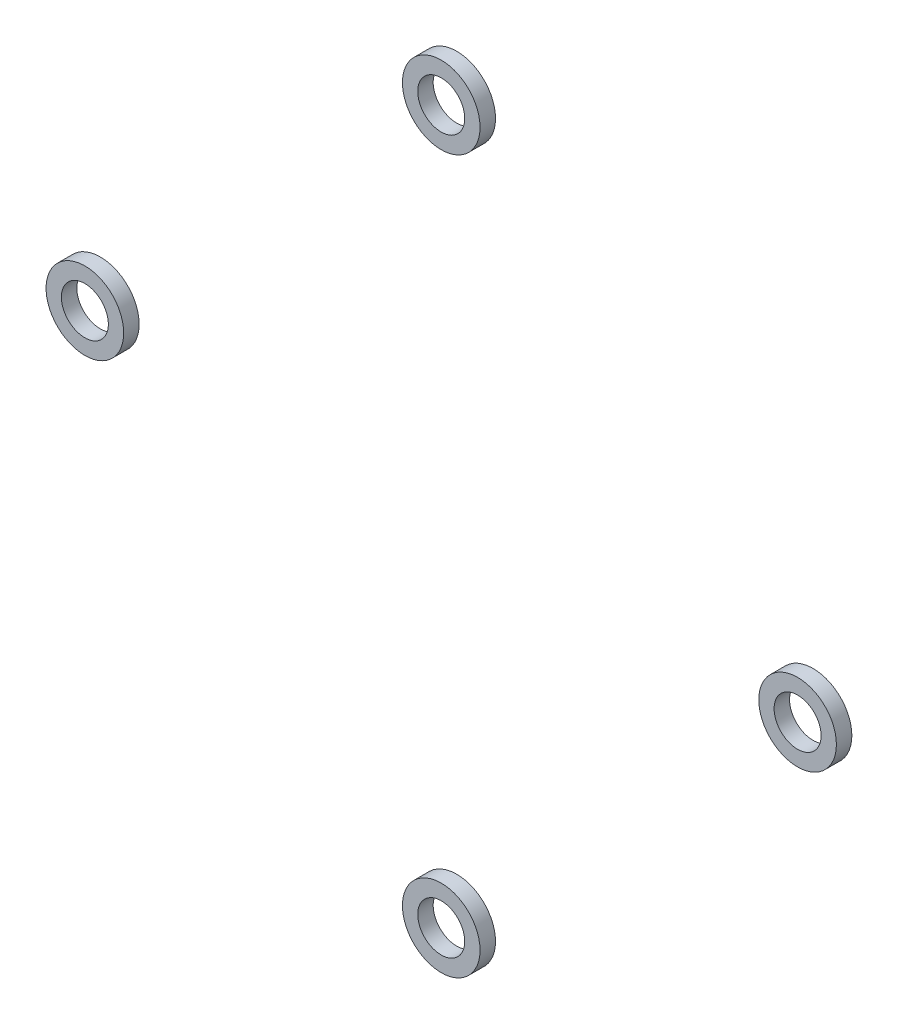
ISO-10303-21;
HEADER;
FILE_DESCRIPTION(('STEP AP214'),'2;1');
FILE_NAME('part.step','',(''),(''),'','','');
FILE_SCHEMA(('AUTOMOTIVE_DESIGN { 1 0 10303 214 1 1 1 1 }'));
ENDSEC;
DATA;
#1=APPLICATION_CONTEXT('core data for automotive mechanical design processes');
#2=APPLICATION_PROTOCOL_DEFINITION('international standard','automotive_design',2000,#1);
#3=PRODUCT_CONTEXT('',#1,'mechanical');
#4=PRODUCT('Part','Part','',(#3));
#5=PRODUCT_RELATED_PRODUCT_CATEGORY('part','',(#4));
#6=PRODUCT_DEFINITION_FORMATION('','',#4);
#7=PRODUCT_DEFINITION_CONTEXT('part definition',#1,'design');
#8=PRODUCT_DEFINITION('design','',#6,#7);
#9=PRODUCT_DEFINITION_SHAPE('','',#8);
#10=(LENGTH_UNIT() NAMED_UNIT(*) SI_UNIT(.MILLI.,.METRE.));
#11=(NAMED_UNIT(*) PLANE_ANGLE_UNIT() SI_UNIT($,.RADIAN.));
#12=(NAMED_UNIT(*) SI_UNIT($,.STERADIAN.) SOLID_ANGLE_UNIT());
#13=UNCERTAINTY_MEASURE_WITH_UNIT(LENGTH_MEASURE(1.E-05),#10,'distance_accuracy_value','');
#14=(GEOMETRIC_REPRESENTATION_CONTEXT(3) GLOBAL_UNCERTAINTY_ASSIGNED_CONTEXT((#13)) GLOBAL_UNIT_ASSIGNED_CONTEXT((#10,
#11,#12)) REPRESENTATION_CONTEXT('',''));
#15=CARTESIAN_POINT('',(0.,0.,0.));
#16=DIRECTION('',(0.,0.,1.));
#17=DIRECTION('',(1.,0.,0.));
#18=AXIS2_PLACEMENT_3D('',#15,#16,#17);
#19=CARTESIAN_POINT('',(-47.7484897317099,-1.51215245581951,54.0000000000118));
#20=DIRECTION('',(0.,0.,1.));
#21=DIRECTION('',(1.,0.,0.));
#22=AXIS2_PLACEMENT_3D('',#19,#20,#21);
#23=PLANE('',#22);
#24=CARTESIAN_POINT('',(-47.7484897317099,-1.51215245581951,54.0000000000118));
#25=DIRECTION('',(0.,0.,1.));
#26=DIRECTION('',(1.,0.,0.));
#27=AXIS2_PLACEMENT_3D('',#24,#25,#26);
#28=CIRCLE('',#27,2.51);
#29=CARTESIAN_POINT('',(-45.2384897317099,-1.51215245581951,54.0000000000118));
#30=VERTEX_POINT('',#29);
#31=EDGE_CURVE('E11',#30,#30,#28,.T.);
#32=ORIENTED_EDGE('',*,*,#31,.T.);
#33=EDGE_LOOP('',(#32));
#34=FACE_BOUND('',#33,.T.);
#35=CARTESIAN_POINT('',(-47.7484897317099,-1.51215245581951,54.0000000000118));
#36=DIRECTION('',(0.,0.,1.));
#37=DIRECTION('',(1.,0.,0.));
#38=AXIS2_PLACEMENT_3D('',#35,#36,#37);
#39=CIRCLE('',#38,1.52);
#40=CARTESIAN_POINT('',(-46.2284897317099,-1.51215245581951,54.0000000000118));
#41=VERTEX_POINT('',#40);
#42=EDGE_CURVE('E53',#41,#41,#39,.T.);
#43=ORIENTED_EDGE('',*,*,#42,.F.);
#44=EDGE_LOOP('',(#43));
#45=FACE_BOUND('',#44,.T.);
#46=ADVANCED_FACE('F42',(#34,#45),#23,.T.);
#47=CARTESIAN_POINT('',(-47.7484897317099,-1.51215245581951,53.0000000000118));
#48=DIRECTION('',(0.,0.,1.));
#49=DIRECTION('',(1.,0.,0.));
#50=AXIS2_PLACEMENT_3D('',#47,#48,#49);
#51=PLANE('',#50);
#52=CARTESIAN_POINT('',(-47.7484897317099,-1.51215245581951,53.0000000000118));
#53=DIRECTION('',(0.,0.,1.));
#54=DIRECTION('',(1.,0.,0.));
#55=AXIS2_PLACEMENT_3D('',#52,#53,#54);
#56=CIRCLE('',#55,2.51);
#57=CARTESIAN_POINT('',(-45.2384897317099,-1.51215245581951,53.0000000000118));
#58=VERTEX_POINT('',#57);
#59=EDGE_CURVE('E46',#58,#58,#56,.T.);
#60=ORIENTED_EDGE('',*,*,#59,.F.);
#61=EDGE_LOOP('',(#60));
#62=FACE_BOUND('',#61,.T.);
#63=CARTESIAN_POINT('',(-47.7484897317099,-1.51215245581951,53.0000000000118));
#64=DIRECTION('',(0.,0.,1.));
#65=DIRECTION('',(1.,0.,0.));
#66=AXIS2_PLACEMENT_3D('',#63,#64,#65);
#67=CIRCLE('',#66,1.52);
#68=CARTESIAN_POINT('',(-46.2284897317099,-1.51215245581951,53.0000000000118));
#69=VERTEX_POINT('',#68);
#70=EDGE_CURVE('E55',#69,#69,#67,.T.);
#71=ORIENTED_EDGE('',*,*,#70,.T.);
#72=EDGE_LOOP('',(#71));
#73=FACE_BOUND('',#72,.T.);
#74=ADVANCED_FACE('F65',(#62,#73),#51,.F.);
#75=CARTESIAN_POINT('',(-47.7484897317099,-1.51215245581951,54.0000000000118));
#76=DIRECTION('',(0.,0.,-1.));
#77=DIRECTION('',(-1.,0.,0.));
#78=AXIS2_PLACEMENT_3D('',#75,#76,#77);
#79=CYLINDRICAL_SURFACE('',#78,2.51);
#80=ORIENTED_EDGE('',*,*,#31,.F.);
#81=EDGE_LOOP('',(#80));
#82=FACE_BOUND('',#81,.T.);
#83=ORIENTED_EDGE('',*,*,#59,.T.);
#84=EDGE_LOOP('',(#83));
#85=FACE_BOUND('',#84,.T.);
#86=ADVANCED_FACE('F44',(#82,#85),#79,.T.);
#87=CARTESIAN_POINT('',(-47.7484897317099,-1.51215245581951,54.0000000000118));
#88=DIRECTION('',(0.,0.,-1.));
#89=DIRECTION('',(-1.,0.,0.));
#90=AXIS2_PLACEMENT_3D('',#87,#88,#89);
#91=CYLINDRICAL_SURFACE('',#90,1.52);
#92=ORIENTED_EDGE('',*,*,#42,.T.);
#93=EDGE_LOOP('',(#92));
#94=FACE_BOUND('',#93,.T.);
#95=ORIENTED_EDGE('',*,*,#70,.F.);
#96=EDGE_LOOP('',(#95));
#97=FACE_BOUND('',#96,.T.);
#98=ADVANCED_FACE('F61',(#94,#97),#91,.F.);
#99=CLOSED_SHELL('',(#46,#74,#86,#98));
#100=MANIFOLD_SOLID_BREP('B2',#99);
#101=CARTESIAN_POINT('',(-24.6984901117098,-24.5621520758178,54.0000000000118));
#102=DIRECTION('',(0.,0.,1.));
#103=DIRECTION('',(1.,0.,0.));
#104=AXIS2_PLACEMENT_3D('',#101,#102,#103);
#105=PLANE('',#104);
#106=CARTESIAN_POINT('',(-24.6984901117098,-24.5621520758178,54.0000000000118));
#107=DIRECTION('',(0.,0.,1.));
#108=DIRECTION('',(1.,0.,0.));
#109=AXIS2_PLACEMENT_3D('',#106,#107,#108);
#110=CIRCLE('',#109,2.51);
#111=CARTESIAN_POINT('',(-22.1884901117098,-24.5621520758178,54.0000000000118));
#112=VERTEX_POINT('',#111);
#113=EDGE_CURVE('E41',#112,#112,#110,.T.);
#114=ORIENTED_EDGE('',*,*,#113,.T.);
#115=EDGE_LOOP('',(#114));
#116=FACE_BOUND('',#115,.T.);
#117=CARTESIAN_POINT('',(-24.6984901117098,-24.5621520758178,54.0000000000118));
#118=DIRECTION('',(0.,0.,1.));
#119=DIRECTION('',(1.,0.,0.));
#120=AXIS2_PLACEMENT_3D('',#117,#118,#119);
#121=CIRCLE('',#120,1.52);
#122=CARTESIAN_POINT('',(-23.1784901117098,-24.5621520758178,54.0000000000118));
#123=VERTEX_POINT('',#122);
#124=EDGE_CURVE('E123',#123,#123,#121,.T.);
#125=ORIENTED_EDGE('',*,*,#124,.F.);
#126=EDGE_LOOP('',(#125));
#127=FACE_BOUND('',#126,.T.);
#128=ADVANCED_FACE('F112',(#116,#127),#105,.T.);
#129=CARTESIAN_POINT('',(-24.6984901117098,-24.5621520758178,53.0000000000118));
#130=DIRECTION('',(0.,0.,1.));
#131=DIRECTION('',(1.,0.,0.));
#132=AXIS2_PLACEMENT_3D('',#129,#130,#131);
#133=PLANE('',#132);
#134=CARTESIAN_POINT('',(-24.6984901117098,-24.5621520758178,53.0000000000118));
#135=DIRECTION('',(0.,0.,1.));
#136=DIRECTION('',(1.,0.,0.));
#137=AXIS2_PLACEMENT_3D('',#134,#135,#136);
#138=CIRCLE('',#137,2.51);
#139=CARTESIAN_POINT('',(-22.1884901117098,-24.5621520758178,53.0000000000118));
#140=VERTEX_POINT('',#139);
#141=EDGE_CURVE('E116',#140,#140,#138,.T.);
#142=ORIENTED_EDGE('',*,*,#141,.F.);
#143=EDGE_LOOP('',(#142));
#144=FACE_BOUND('',#143,.T.);
#145=CARTESIAN_POINT('',(-24.6984901117098,-24.5621520758178,53.0000000000118));
#146=DIRECTION('',(0.,0.,1.));
#147=DIRECTION('',(1.,0.,0.));
#148=AXIS2_PLACEMENT_3D('',#145,#146,#147);
#149=CIRCLE('',#148,1.52);
#150=CARTESIAN_POINT('',(-23.1784901117098,-24.5621520758178,53.0000000000118));
#151=VERTEX_POINT('',#150);
#152=EDGE_CURVE('E125',#151,#151,#149,.T.);
#153=ORIENTED_EDGE('',*,*,#152,.T.);
#154=EDGE_LOOP('',(#153));
#155=FACE_BOUND('',#154,.T.);
#156=ADVANCED_FACE('F135',(#144,#155),#133,.F.);
#157=CARTESIAN_POINT('',(-24.6984901117098,-24.5621520758178,54.0000000000118));
#158=DIRECTION('',(0.,0.,-1.));
#159=DIRECTION('',(-1.,0.,0.));
#160=AXIS2_PLACEMENT_3D('',#157,#158,#159);
#161=CYLINDRICAL_SURFACE('',#160,2.51);
#162=ORIENTED_EDGE('',*,*,#113,.F.);
#163=EDGE_LOOP('',(#162));
#164=FACE_BOUND('',#163,.T.);
#165=ORIENTED_EDGE('',*,*,#141,.T.);
#166=EDGE_LOOP('',(#165));
#167=FACE_BOUND('',#166,.T.);
#168=ADVANCED_FACE('F114',(#164,#167),#161,.T.);
#169=CARTESIAN_POINT('',(-24.6984901117098,-24.5621520758178,54.0000000000118));
#170=DIRECTION('',(0.,0.,-1.));
#171=DIRECTION('',(-1.,0.,0.));
#172=AXIS2_PLACEMENT_3D('',#169,#170,#171);
#173=CYLINDRICAL_SURFACE('',#172,1.52);
#174=ORIENTED_EDGE('',*,*,#124,.T.);
#175=EDGE_LOOP('',(#174));
#176=FACE_BOUND('',#175,.T.);
#177=ORIENTED_EDGE('',*,*,#152,.F.);
#178=EDGE_LOOP('',(#177));
#179=FACE_BOUND('',#178,.T.);
#180=ADVANCED_FACE('F131',(#176,#179),#173,.F.);
#181=CLOSED_SHELL('',(#128,#156,#168,#180));
#182=MANIFOLD_SOLID_BREP('B6',#181);
#183=CARTESIAN_POINT('',(-1.64849049171162,-1.51215245581764,54.0000000000118));
#184=DIRECTION('',(0.,0.,1.));
#185=DIRECTION('',(1.,0.,0.));
#186=AXIS2_PLACEMENT_3D('',#183,#184,#185);
#187=PLANE('',#186);
#188=CARTESIAN_POINT('',(-1.64849049171162,-1.51215245581764,54.0000000000118));
#189=DIRECTION('',(0.,0.,1.));
#190=DIRECTION('',(1.,0.,0.));
#191=AXIS2_PLACEMENT_3D('',#188,#189,#190);
#192=CIRCLE('',#191,2.51);
#193=CARTESIAN_POINT('',(0.861509508288372,-1.51215245581764,54.0000000000118));
#194=VERTEX_POINT('',#193);
#195=EDGE_CURVE('E111',#194,#194,#192,.T.);
#196=ORIENTED_EDGE('',*,*,#195,.T.);
#197=EDGE_LOOP('',(#196));
#198=FACE_BOUND('',#197,.T.);
#199=CARTESIAN_POINT('',(-1.64849049171162,-1.51215245581764,54.0000000000118));
#200=DIRECTION('',(0.,0.,1.));
#201=DIRECTION('',(1.,0.,0.));
#202=AXIS2_PLACEMENT_3D('',#199,#200,#201);
#203=CIRCLE('',#202,1.52);
#204=CARTESIAN_POINT('',(-0.128490491711625,-1.51215245581764,54.0000000000118));
#205=VERTEX_POINT('',#204);
#206=EDGE_CURVE('E192',#205,#205,#203,.T.);
#207=ORIENTED_EDGE('',*,*,#206,.F.);
#208=EDGE_LOOP('',(#207));
#209=FACE_BOUND('',#208,.T.);
#210=ADVANCED_FACE('F181',(#198,#209),#187,.T.);
#211=CARTESIAN_POINT('',(-1.64849049171162,-1.51215245581764,53.0000000000118));
#212=DIRECTION('',(0.,0.,1.));
#213=DIRECTION('',(1.,0.,0.));
#214=AXIS2_PLACEMENT_3D('',#211,#212,#213);
#215=PLANE('',#214);
#216=CARTESIAN_POINT('',(-1.64849049171162,-1.51215245581764,53.0000000000118));
#217=DIRECTION('',(0.,0.,1.));
#218=DIRECTION('',(1.,0.,0.));
#219=AXIS2_PLACEMENT_3D('',#216,#217,#218);
#220=CIRCLE('',#219,2.51);
#221=CARTESIAN_POINT('',(0.861509508288372,-1.51215245581764,53.0000000000118));
#222=VERTEX_POINT('',#221);
#223=EDGE_CURVE('E185',#222,#222,#220,.T.);
#224=ORIENTED_EDGE('',*,*,#223,.F.);
#225=EDGE_LOOP('',(#224));
#226=FACE_BOUND('',#225,.T.);
#227=CARTESIAN_POINT('',(-1.64849049171162,-1.51215245581764,53.0000000000118));
#228=DIRECTION('',(0.,0.,1.));
#229=DIRECTION('',(1.,0.,0.));
#230=AXIS2_PLACEMENT_3D('',#227,#228,#229);
#231=CIRCLE('',#230,1.52);
#232=CARTESIAN_POINT('',(-0.128490491711625,-1.51215245581764,53.0000000000118));
#233=VERTEX_POINT('',#232);
#234=EDGE_CURVE('E194',#233,#233,#231,.T.);
#235=ORIENTED_EDGE('',*,*,#234,.T.);
#236=EDGE_LOOP('',(#235));
#237=FACE_BOUND('',#236,.T.);
#238=ADVANCED_FACE('F204',(#226,#237),#215,.F.);
#239=CARTESIAN_POINT('',(-1.64849049171162,-1.51215245581764,54.0000000000118));
#240=DIRECTION('',(0.,0.,-1.));
#241=DIRECTION('',(-1.,0.,0.));
#242=AXIS2_PLACEMENT_3D('',#239,#240,#241);
#243=CYLINDRICAL_SURFACE('',#242,2.51);
#244=ORIENTED_EDGE('',*,*,#195,.F.);
#245=EDGE_LOOP('',(#244));
#246=FACE_BOUND('',#245,.T.);
#247=ORIENTED_EDGE('',*,*,#223,.T.);
#248=EDGE_LOOP('',(#247));
#249=FACE_BOUND('',#248,.T.);
#250=ADVANCED_FACE('F183',(#246,#249),#243,.T.);
#251=CARTESIAN_POINT('',(-1.64849049171162,-1.51215245581764,54.0000000000118));
#252=DIRECTION('',(0.,0.,-1.));
#253=DIRECTION('',(-1.,0.,0.));
#254=AXIS2_PLACEMENT_3D('',#251,#252,#253);
#255=CYLINDRICAL_SURFACE('',#254,1.52);
#256=ORIENTED_EDGE('',*,*,#206,.T.);
#257=EDGE_LOOP('',(#256));
#258=FACE_BOUND('',#257,.T.);
#259=ORIENTED_EDGE('',*,*,#234,.F.);
#260=EDGE_LOOP('',(#259));
#261=FACE_BOUND('',#260,.T.);
#262=ADVANCED_FACE('F200',(#258,#261),#255,.F.);
#263=CLOSED_SHELL('',(#210,#238,#250,#262));
#264=MANIFOLD_SOLID_BREP('B36',#263);
#265=CARTESIAN_POINT('',(-24.6984901117119,21.5378471641805,54.0000000000118));
#266=DIRECTION('',(0.,0.,1.));
#267=DIRECTION('',(1.,0.,0.));
#268=AXIS2_PLACEMENT_3D('',#265,#266,#267);
#269=PLANE('',#268);
#270=CARTESIAN_POINT('',(-24.6984901117119,21.5378471641805,54.0000000000118));
#271=DIRECTION('',(0.,0.,1.));
#272=DIRECTION('',(1.,0.,0.));
#273=AXIS2_PLACEMENT_3D('',#270,#271,#272);
#274=CIRCLE('',#273,2.51);
#275=CARTESIAN_POINT('',(-22.1884901117119,21.5378471641805,54.0000000000118));
#276=VERTEX_POINT('',#275);
#277=EDGE_CURVE('E180',#276,#276,#274,.T.);
#278=ORIENTED_EDGE('',*,*,#277,.T.);
#279=EDGE_LOOP('',(#278));
#280=FACE_BOUND('',#279,.T.);
#281=CARTESIAN_POINT('',(-24.6984901117119,21.5378471641805,54.0000000000118));
#282=DIRECTION('',(0.,0.,1.));
#283=DIRECTION('',(1.,0.,0.));
#284=AXIS2_PLACEMENT_3D('',#281,#282,#283);
#285=CIRCLE('',#284,1.52);
#286=CARTESIAN_POINT('',(-23.1784901117119,21.5378471641805,54.0000000000118));
#287=VERTEX_POINT('',#286);
#288=EDGE_CURVE('E254',#287,#287,#285,.T.);
#289=ORIENTED_EDGE('',*,*,#288,.F.);
#290=EDGE_LOOP('',(#289));
#291=FACE_BOUND('',#290,.T.);
#292=ADVANCED_FACE('F243',(#280,#291),#269,.T.);
#293=CARTESIAN_POINT('',(-24.6984901117119,21.5378471641805,53.0000000000118));
#294=DIRECTION('',(0.,0.,1.));
#295=DIRECTION('',(1.,0.,0.));
#296=AXIS2_PLACEMENT_3D('',#293,#294,#295);
#297=PLANE('',#296);
#298=CARTESIAN_POINT('',(-24.6984901117119,21.5378471641805,53.0000000000118));
#299=DIRECTION('',(0.,0.,1.));
#300=DIRECTION('',(1.,0.,0.));
#301=AXIS2_PLACEMENT_3D('',#298,#299,#300);
#302=CIRCLE('',#301,2.51);
#303=CARTESIAN_POINT('',(-22.1884901117119,21.5378471641805,53.0000000000118));
#304=VERTEX_POINT('',#303);
#305=EDGE_CURVE('E247',#304,#304,#302,.T.);
#306=ORIENTED_EDGE('',*,*,#305,.F.);
#307=EDGE_LOOP('',(#306));
#308=FACE_BOUND('',#307,.T.);
#309=CARTESIAN_POINT('',(-24.6984901117119,21.5378471641805,53.0000000000118));
#310=DIRECTION('',(0.,0.,1.));
#311=DIRECTION('',(1.,0.,0.));
#312=AXIS2_PLACEMENT_3D('',#309,#310,#311);
#313=CIRCLE('',#312,1.52);
#314=CARTESIAN_POINT('',(-23.1784901117119,21.5378471641805,53.0000000000118));
#315=VERTEX_POINT('',#314);
#316=EDGE_CURVE('E256',#315,#315,#313,.T.);
#317=ORIENTED_EDGE('',*,*,#316,.T.);
#318=EDGE_LOOP('',(#317));
#319=FACE_BOUND('',#318,.T.);
#320=ADVANCED_FACE('F266',(#308,#319),#297,.F.);
#321=CARTESIAN_POINT('',(-24.6984901117119,21.5378471641805,54.0000000000118));
#322=DIRECTION('',(0.,0.,-1.));
#323=DIRECTION('',(-1.,0.,0.));
#324=AXIS2_PLACEMENT_3D('',#321,#322,#323);
#325=CYLINDRICAL_SURFACE('',#324,2.51);
#326=ORIENTED_EDGE('',*,*,#277,.F.);
#327=EDGE_LOOP('',(#326));
#328=FACE_BOUND('',#327,.T.);
#329=ORIENTED_EDGE('',*,*,#305,.T.);
#330=EDGE_LOOP('',(#329));
#331=FACE_BOUND('',#330,.T.);
#332=ADVANCED_FACE('F245',(#328,#331),#325,.T.);
#333=CARTESIAN_POINT('',(-24.6984901117119,21.5378471641805,54.0000000000118));
#334=DIRECTION('',(0.,0.,-1.));
#335=DIRECTION('',(-1.,0.,0.));
#336=AXIS2_PLACEMENT_3D('',#333,#334,#335);
#337=CYLINDRICAL_SURFACE('',#336,1.52);
#338=ORIENTED_EDGE('',*,*,#288,.T.);
#339=EDGE_LOOP('',(#338));
#340=FACE_BOUND('',#339,.T.);
#341=ORIENTED_EDGE('',*,*,#316,.F.);
#342=EDGE_LOOP('',(#341));
#343=FACE_BOUND('',#342,.T.);
#344=ADVANCED_FACE('F262',(#340,#343),#337,.F.);
#345=CLOSED_SHELL('',(#292,#320,#332,#344));
#346=MANIFOLD_SOLID_BREP('B106',#345);
#347=ADVANCED_BREP_SHAPE_REPRESENTATION('',(#18,#100,#182,#264,#346),#14);
#348=SHAPE_DEFINITION_REPRESENTATION(#9,#347);
ENDSEC;
END-ISO-10303-21;
